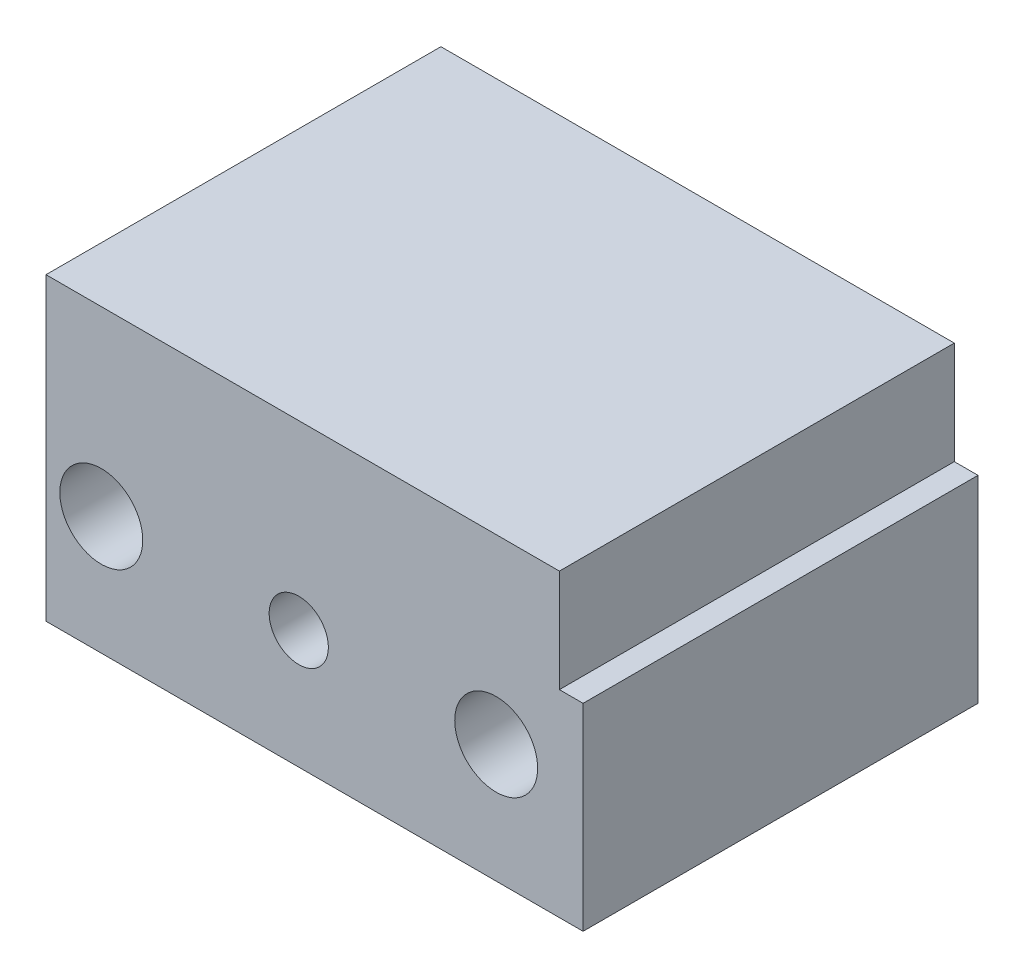
ISO-10303-21;
HEADER;
FILE_DESCRIPTION(('STEP AP214'),'2;1');
FILE_NAME('part.step','',(''),(''),'','','');
FILE_SCHEMA(('AUTOMOTIVE_DESIGN { 1 0 10303 214 1 1 1 1 }'));
ENDSEC;
DATA;
#1=APPLICATION_CONTEXT('core data for automotive mechanical design processes');
#2=APPLICATION_PROTOCOL_DEFINITION('international standard','automotive_design',2000,#1);
#3=PRODUCT_CONTEXT('',#1,'mechanical');
#4=PRODUCT('Part','Part','',(#3));
#5=PRODUCT_RELATED_PRODUCT_CATEGORY('part','',(#4));
#6=PRODUCT_DEFINITION_FORMATION('','',#4);
#7=PRODUCT_DEFINITION_CONTEXT('part definition',#1,'design');
#8=PRODUCT_DEFINITION('design','',#6,#7);
#9=PRODUCT_DEFINITION_SHAPE('','',#8);
#10=(LENGTH_UNIT() NAMED_UNIT(*) SI_UNIT(.MILLI.,.METRE.));
#11=(NAMED_UNIT(*) PLANE_ANGLE_UNIT() SI_UNIT($,.RADIAN.));
#12=(NAMED_UNIT(*) SI_UNIT($,.STERADIAN.) SOLID_ANGLE_UNIT());
#13=UNCERTAINTY_MEASURE_WITH_UNIT(LENGTH_MEASURE(1.E-05),#10,'distance_accuracy_value','');
#14=(GEOMETRIC_REPRESENTATION_CONTEXT(3) GLOBAL_UNCERTAINTY_ASSIGNED_CONTEXT((#13)) GLOBAL_UNIT_ASSIGNED_CONTEXT((#10,
#11,#12)) REPRESENTATION_CONTEXT('',''));
#15=CARTESIAN_POINT('',(0.,0.,0.));
#16=DIRECTION('',(0.,0.,1.));
#17=DIRECTION('',(1.,0.,0.));
#18=AXIS2_PLACEMENT_3D('',#15,#16,#17);
#19=CARTESIAN_POINT('',(0.,4.,0.));
#20=DIRECTION('',(0.,1.,0.));
#21=DIRECTION('',(0.,0.,1.));
#22=AXIS2_PLACEMENT_3D('',#19,#20,#21);
#23=PLANE('',#22);
#24=DIRECTION('',(1.,0.,0.));
#25=VECTOR('',#24,1.);
#26=CARTESIAN_POINT('',(0.,4.,5.));
#27=LINE('',#26,#25);
#28=CARTESIAN_POINT('',(0.,4.,5.));
#29=VERTEX_POINT('',#28);
#30=CARTESIAN_POINT('',(6.5,4.,5.));
#31=VERTEX_POINT('',#30);
#32=EDGE_CURVE('E148',#29,#31,#27,.T.);
#33=ORIENTED_EDGE('',*,*,#32,.T.);
#34=DIRECTION('',(0.,0.,1.));
#35=VECTOR('',#34,1.);
#36=CARTESIAN_POINT('',(6.5,4.,5.));
#37=LINE('',#36,#35);
#38=CARTESIAN_POINT('',(6.5,4.,0.));
#39=VERTEX_POINT('',#38);
#40=EDGE_CURVE('E106',#39,#31,#37,.T.);
#41=ORIENTED_EDGE('',*,*,#40,.F.);
#42=DIRECTION('',(-1.,0.,0.));
#43=VECTOR('',#42,1.);
#44=CARTESIAN_POINT('',(6.8,4.,0.));
#45=LINE('',#44,#43);
#46=CARTESIAN_POINT('',(0.,4.,0.));
#47=VERTEX_POINT('',#46);
#48=EDGE_CURVE('E144',#39,#47,#45,.T.);
#49=ORIENTED_EDGE('',*,*,#48,.T.);
#50=DIRECTION('',(0.,0.,1.));
#51=VECTOR('',#50,1.);
#52=CARTESIAN_POINT('',(0.,4.,0.));
#53=LINE('',#52,#51);
#54=EDGE_CURVE('E156',#47,#29,#53,.T.);
#55=ORIENTED_EDGE('',*,*,#54,.T.);
#56=EDGE_LOOP('',(#33,#41,#49,#55));
#57=FACE_BOUND('',#56,.T.);
#58=ADVANCED_FACE('F34',(#57),#23,.T.);
#59=CARTESIAN_POINT('',(6.8,0.2,0.));
#60=DIRECTION('',(0.,0.,-1.));
#61=DIRECTION('',(-1.,0.,0.));
#62=AXIS2_PLACEMENT_3D('',#59,#60,#61);
#63=PLANE('',#62);
#64=CARTESIAN_POINT('',(3.2,1.7,0.));
#65=DIRECTION('',(0.,0.,-1.));
#66=DIRECTION('',(-1.,0.,0.));
#67=AXIS2_PLACEMENT_3D('',#64,#65,#66);
#68=CIRCLE('',#67,0.374999999999999);
#69=CARTESIAN_POINT('',(2.825,1.7,0.));
#70=VERTEX_POINT('',#69);
#71=EDGE_CURVE('E172',#70,#70,#68,.T.);
#72=ORIENTED_EDGE('',*,*,#71,.F.);
#73=EDGE_LOOP('',(#72));
#74=FACE_BOUND('',#73,.T.);
#75=DIRECTION('',(1.,0.,0.));
#76=VECTOR('',#75,1.);
#77=CARTESIAN_POINT('',(6.5,2.7,0.));
#78=LINE('',#77,#76);
#79=CARTESIAN_POINT('',(6.5,2.7,0.));
#80=VERTEX_POINT('',#79);
#81=CARTESIAN_POINT('',(6.8,2.7,0.));
#82=VERTEX_POINT('',#81);
#83=EDGE_CURVE('E101',#80,#82,#78,.T.);
#84=ORIENTED_EDGE('',*,*,#83,.T.);
#85=DIRECTION('',(0.,1.,0.));
#86=VECTOR('',#85,1.);
#87=CARTESIAN_POINT('',(6.8,0.2,0.));
#88=LINE('',#87,#86);
#89=CARTESIAN_POINT('',(6.8,0.2,0.));
#90=VERTEX_POINT('',#89);
#91=EDGE_CURVE('E11',#90,#82,#88,.T.);
#92=ORIENTED_EDGE('',*,*,#91,.F.);
#93=DIRECTION('',(-1.,0.,0.));
#94=VECTOR('',#93,1.);
#95=CARTESIAN_POINT('',(6.8,0.2,0.));
#96=LINE('',#95,#94);
#97=CARTESIAN_POINT('',(0.,0.2,0.));
#98=VERTEX_POINT('',#97);
#99=EDGE_CURVE('E145',#90,#98,#96,.T.);
#100=ORIENTED_EDGE('',*,*,#99,.T.);
#101=DIRECTION('',(0.,1.,0.));
#102=VECTOR('',#101,1.);
#103=CARTESIAN_POINT('',(0.,0.2,0.));
#104=LINE('',#103,#102);
#105=EDGE_CURVE('E38',#98,#47,#104,.T.);
#106=ORIENTED_EDGE('',*,*,#105,.T.);
#107=ORIENTED_EDGE('',*,*,#48,.F.);
#108=DIRECTION('',(0.,1.,0.));
#109=VECTOR('',#108,1.);
#110=CARTESIAN_POINT('',(6.5,4.,0.));
#111=LINE('',#110,#109);
#112=EDGE_CURVE('E51',#80,#39,#111,.T.);
#113=ORIENTED_EDGE('',*,*,#112,.F.);
#114=EDGE_LOOP('',(#84,#92,#100,#106,#107,#113));
#115=FACE_BOUND('',#114,.T.);
#116=CARTESIAN_POINT('',(5.7,1.7,0.));
#117=DIRECTION('',(0.,0.,-1.));
#118=DIRECTION('',(-1.,0.,0.));
#119=AXIS2_PLACEMENT_3D('',#116,#117,#118);
#120=CIRCLE('',#119,0.650000000000015);
#121=CARTESIAN_POINT('',(5.04999999999998,1.7,0.));
#122=VERTEX_POINT('',#121);
#123=EDGE_CURVE('E116',#122,#122,#120,.T.);
#124=ORIENTED_EDGE('',*,*,#123,.F.);
#125=EDGE_LOOP('',(#124));
#126=FACE_BOUND('',#125,.T.);
#127=CARTESIAN_POINT('',(0.700000000000001,1.7,0.));
#128=DIRECTION('',(0.,0.,-1.));
#129=DIRECTION('',(-1.,0.,0.));
#130=AXIS2_PLACEMENT_3D('',#127,#128,#129);
#131=CIRCLE('',#130,0.650000000000015);
#132=CARTESIAN_POINT('',(0.0499999999999854,1.7,0.));
#133=VERTEX_POINT('',#132);
#134=EDGE_CURVE('E132',#133,#133,#131,.T.);
#135=ORIENTED_EDGE('',*,*,#134,.F.);
#136=EDGE_LOOP('',(#135));
#137=FACE_BOUND('',#136,.T.);
#138=ADVANCED_FACE('F36',(#74,#115,#126,#137),#63,.T.);
#139=CARTESIAN_POINT('',(6.8,0.2,5.));
#140=DIRECTION('',(1.,0.,0.));
#141=DIRECTION('',(0.,0.,-1.));
#142=AXIS2_PLACEMENT_3D('',#139,#140,#141);
#143=PLANE('',#142);
#144=DIRECTION('',(0.,0.,-1.));
#145=VECTOR('',#144,1.);
#146=CARTESIAN_POINT('',(6.8,2.7,5.));
#147=LINE('',#146,#145);
#148=CARTESIAN_POINT('',(6.8,2.7,5.));
#149=VERTEX_POINT('',#148);
#150=EDGE_CURVE('E109',#149,#82,#147,.T.);
#151=ORIENTED_EDGE('',*,*,#150,.F.);
#152=DIRECTION('',(0.,1.,0.));
#153=VECTOR('',#152,1.);
#154=CARTESIAN_POINT('',(6.8,0.2,5.));
#155=LINE('',#154,#153);
#156=CARTESIAN_POINT('',(6.8,0.2,5.));
#157=VERTEX_POINT('',#156);
#158=EDGE_CURVE('E43',#157,#149,#155,.T.);
#159=ORIENTED_EDGE('',*,*,#158,.F.);
#160=DIRECTION('',(0.,0.,-1.));
#161=VECTOR('',#160,1.);
#162=CARTESIAN_POINT('',(6.8,0.2,5.));
#163=LINE('',#162,#161);
#164=EDGE_CURVE('E152',#157,#90,#163,.T.);
#165=ORIENTED_EDGE('',*,*,#164,.T.);
#166=ORIENTED_EDGE('',*,*,#91,.T.);
#167=EDGE_LOOP('',(#151,#159,#165,#166));
#168=FACE_BOUND('',#167,.T.);
#169=ADVANCED_FACE('F169',(#168),#143,.T.);
#170=CARTESIAN_POINT('',(0.,0.2,5.));
#171=DIRECTION('',(0.,0.,1.));
#172=DIRECTION('',(1.,0.,0.));
#173=AXIS2_PLACEMENT_3D('',#170,#171,#172);
#174=PLANE('',#173);
#175=CARTESIAN_POINT('',(3.2,1.7,5.));
#176=DIRECTION('',(0.,0.,1.));
#177=DIRECTION('',(1.,0.,0.));
#178=AXIS2_PLACEMENT_3D('',#175,#176,#177);
#179=CIRCLE('',#178,0.374999999999999);
#180=CARTESIAN_POINT('',(3.575,1.7,5.));
#181=VERTEX_POINT('',#180);
#182=EDGE_CURVE('E170',#181,#181,#179,.T.);
#183=ORIENTED_EDGE('',*,*,#182,.F.);
#184=EDGE_LOOP('',(#183));
#185=FACE_BOUND('',#184,.T.);
#186=DIRECTION('',(1.,0.,0.));
#187=VECTOR('',#186,1.);
#188=CARTESIAN_POINT('',(6.5,2.7,5.));
#189=LINE('',#188,#187);
#190=CARTESIAN_POINT('',(6.5,2.7,5.));
#191=VERTEX_POINT('',#190);
#192=EDGE_CURVE('E99',#191,#149,#189,.T.);
#193=ORIENTED_EDGE('',*,*,#192,.F.);
#194=DIRECTION('',(0.,-1.,0.));
#195=VECTOR('',#194,1.);
#196=CARTESIAN_POINT('',(6.5,4.,5.));
#197=LINE('',#196,#195);
#198=EDGE_CURVE('E102',#31,#191,#197,.T.);
#199=ORIENTED_EDGE('',*,*,#198,.F.);
#200=ORIENTED_EDGE('',*,*,#32,.F.);
#201=DIRECTION('',(0.,1.,0.));
#202=VECTOR('',#201,1.);
#203=CARTESIAN_POINT('',(0.,0.2,5.));
#204=LINE('',#203,#202);
#205=CARTESIAN_POINT('',(0.,0.2,5.));
#206=VERTEX_POINT('',#205);
#207=EDGE_CURVE('E75',#206,#29,#204,.T.);
#208=ORIENTED_EDGE('',*,*,#207,.F.);
#209=DIRECTION('',(1.,0.,0.));
#210=VECTOR('',#209,1.);
#211=CARTESIAN_POINT('',(0.,0.2,5.));
#212=LINE('',#211,#210);
#213=EDGE_CURVE('E150',#206,#157,#212,.T.);
#214=ORIENTED_EDGE('',*,*,#213,.T.);
#215=ORIENTED_EDGE('',*,*,#158,.T.);
#216=EDGE_LOOP('',(#193,#199,#200,#208,#214,#215));
#217=FACE_BOUND('',#216,.T.);
#218=CARTESIAN_POINT('',(5.7,1.7,5.));
#219=DIRECTION('',(0.,0.,-1.));
#220=DIRECTION('',(-1.,0.,0.));
#221=AXIS2_PLACEMENT_3D('',#218,#219,#220);
#222=CIRCLE('',#221,0.525000000000013);
#223=CARTESIAN_POINT('',(5.17499999999999,1.7,5.));
#224=VERTEX_POINT('',#223);
#225=EDGE_CURVE('E129',#224,#224,#222,.T.);
#226=ORIENTED_EDGE('',*,*,#225,.T.);
#227=EDGE_LOOP('',(#226));
#228=FACE_BOUND('',#227,.T.);
#229=CARTESIAN_POINT('',(0.700000000000001,1.7,5.));
#230=DIRECTION('',(0.,0.,-1.));
#231=DIRECTION('',(-1.,0.,0.));
#232=AXIS2_PLACEMENT_3D('',#229,#230,#231);
#233=CIRCLE('',#232,0.525000000000013);
#234=CARTESIAN_POINT('',(0.174999999999988,1.7,5.));
#235=VERTEX_POINT('',#234);
#236=EDGE_CURVE('E141',#235,#235,#233,.T.);
#237=ORIENTED_EDGE('',*,*,#236,.T.);
#238=EDGE_LOOP('',(#237));
#239=FACE_BOUND('',#238,.T.);
#240=ADVANCED_FACE('F112',(#185,#217,#228,#239),#174,.T.);
#241=CARTESIAN_POINT('',(0.,0.2,0.));
#242=DIRECTION('',(-1.,0.,0.));
#243=DIRECTION('',(0.,0.,1.));
#244=AXIS2_PLACEMENT_3D('',#241,#242,#243);
#245=PLANE('',#244);
#246=ORIENTED_EDGE('',*,*,#54,.F.);
#247=ORIENTED_EDGE('',*,*,#105,.F.);
#248=DIRECTION('',(0.,0.,1.));
#249=VECTOR('',#248,1.);
#250=CARTESIAN_POINT('',(0.,0.2,0.));
#251=LINE('',#250,#249);
#252=EDGE_CURVE('E147',#98,#206,#251,.T.);
#253=ORIENTED_EDGE('',*,*,#252,.T.);
#254=ORIENTED_EDGE('',*,*,#207,.T.);
#255=EDGE_LOOP('',(#246,#247,#253,#254));
#256=FACE_BOUND('',#255,.T.);
#257=ADVANCED_FACE('F162',(#256),#245,.T.);
#258=CARTESIAN_POINT('',(0.,0.2,0.));
#259=DIRECTION('',(0.,1.,0.));
#260=DIRECTION('',(0.,0.,1.));
#261=AXIS2_PLACEMENT_3D('',#258,#259,#260);
#262=PLANE('',#261);
#263=ORIENTED_EDGE('',*,*,#99,.F.);
#264=ORIENTED_EDGE('',*,*,#164,.F.);
#265=ORIENTED_EDGE('',*,*,#213,.F.);
#266=ORIENTED_EDGE('',*,*,#252,.F.);
#267=EDGE_LOOP('',(#263,#264,#265,#266));
#268=FACE_BOUND('',#267,.T.);
#269=ADVANCED_FACE('F167',(#268),#262,.F.);
#270=CARTESIAN_POINT('',(0.700000000000001,1.7,0.));
#271=DIRECTION('',(0.,0.,-1.));
#272=DIRECTION('',(-1.,0.,0.));
#273=AXIS2_PLACEMENT_3D('',#270,#271,#272);
#274=CYLINDRICAL_SURFACE('',#273,0.525000000000013);
#275=ORIENTED_EDGE('',*,*,#236,.F.);
#276=EDGE_LOOP('',(#275));
#277=FACE_BOUND('',#276,.T.);
#278=CARTESIAN_POINT('',(0.700000000000001,1.7,1.2));
#279=DIRECTION('',(0.,0.,-1.));
#280=DIRECTION('',(-1.,0.,0.));
#281=AXIS2_PLACEMENT_3D('',#278,#279,#280);
#282=CIRCLE('',#281,0.525000000000013);
#283=CARTESIAN_POINT('',(0.174999999999987,1.7,1.2));
#284=VERTEX_POINT('',#283);
#285=EDGE_CURVE('E138',#284,#284,#282,.T.);
#286=ORIENTED_EDGE('',*,*,#285,.T.);
#287=EDGE_LOOP('',(#286));
#288=FACE_BOUND('',#287,.T.);
#289=ADVANCED_FACE('F200',(#277,#288),#274,.F.);
#290=CARTESIAN_POINT('',(1.22500000000001,1.7,1.2));
#291=DIRECTION('',(0.,0.,1.));
#292=DIRECTION('',(1.,0.,0.));
#293=AXIS2_PLACEMENT_3D('',#290,#291,#292);
#294=PLANE('',#293);
#295=ORIENTED_EDGE('',*,*,#285,.F.);
#296=EDGE_LOOP('',(#295));
#297=FACE_BOUND('',#296,.T.);
#298=CARTESIAN_POINT('',(0.700000000000001,1.7,1.2));
#299=DIRECTION('',(0.,0.,-1.));
#300=DIRECTION('',(-1.,0.,0.));
#301=AXIS2_PLACEMENT_3D('',#298,#299,#300);
#302=CIRCLE('',#301,0.650000000000015);
#303=CARTESIAN_POINT('',(0.0499999999999854,1.7,1.2));
#304=VERTEX_POINT('',#303);
#305=EDGE_CURVE('E135',#304,#304,#302,.T.);
#306=ORIENTED_EDGE('',*,*,#305,.T.);
#307=EDGE_LOOP('',(#306));
#308=FACE_BOUND('',#307,.T.);
#309=ADVANCED_FACE('F204',(#297,#308),#294,.F.);
#310=CARTESIAN_POINT('',(0.700000000000001,1.7,0.));
#311=DIRECTION('',(0.,0.,-1.));
#312=DIRECTION('',(-1.,0.,0.));
#313=AXIS2_PLACEMENT_3D('',#310,#311,#312);
#314=CYLINDRICAL_SURFACE('',#313,0.650000000000015);
#315=ORIENTED_EDGE('',*,*,#305,.F.);
#316=EDGE_LOOP('',(#315));
#317=FACE_BOUND('',#316,.T.);
#318=ORIENTED_EDGE('',*,*,#134,.T.);
#319=EDGE_LOOP('',(#318));
#320=FACE_BOUND('',#319,.T.);
#321=ADVANCED_FACE('F209',(#317,#320),#314,.F.);
#322=CARTESIAN_POINT('',(5.7,1.7,0.));
#323=DIRECTION('',(0.,0.,-1.));
#324=DIRECTION('',(-1.,0.,0.));
#325=AXIS2_PLACEMENT_3D('',#322,#323,#324);
#326=CYLINDRICAL_SURFACE('',#325,0.525000000000013);
#327=ORIENTED_EDGE('',*,*,#225,.F.);
#328=EDGE_LOOP('',(#327));
#329=FACE_BOUND('',#328,.T.);
#330=CARTESIAN_POINT('',(5.7,1.7,1.2));
#331=DIRECTION('',(0.,0.,-1.));
#332=DIRECTION('',(-1.,0.,0.));
#333=AXIS2_PLACEMENT_3D('',#330,#331,#332);
#334=CIRCLE('',#333,0.525000000000013);
#335=CARTESIAN_POINT('',(5.17499999999999,1.7,1.2));
#336=VERTEX_POINT('',#335);
#337=EDGE_CURVE('E126',#336,#336,#334,.T.);
#338=ORIENTED_EDGE('',*,*,#337,.T.);
#339=EDGE_LOOP('',(#338));
#340=FACE_BOUND('',#339,.T.);
#341=ADVANCED_FACE('F217',(#329,#340),#326,.F.);
#342=CARTESIAN_POINT('',(6.22500000000001,1.7,1.2));
#343=DIRECTION('',(0.,0.,1.));
#344=DIRECTION('',(1.,0.,0.));
#345=AXIS2_PLACEMENT_3D('',#342,#343,#344);
#346=PLANE('',#345);
#347=ORIENTED_EDGE('',*,*,#337,.F.);
#348=EDGE_LOOP('',(#347));
#349=FACE_BOUND('',#348,.T.);
#350=CARTESIAN_POINT('',(5.7,1.7,1.2));
#351=DIRECTION('',(0.,0.,-1.));
#352=DIRECTION('',(-1.,0.,0.));
#353=AXIS2_PLACEMENT_3D('',#350,#351,#352);
#354=CIRCLE('',#353,0.650000000000015);
#355=CARTESIAN_POINT('',(5.04999999999998,1.7,1.2));
#356=VERTEX_POINT('',#355);
#357=EDGE_CURVE('E123',#356,#356,#354,.T.);
#358=ORIENTED_EDGE('',*,*,#357,.T.);
#359=EDGE_LOOP('',(#358));
#360=FACE_BOUND('',#359,.T.);
#361=ADVANCED_FACE('F221',(#349,#360),#346,.F.);
#362=CARTESIAN_POINT('',(5.7,1.7,0.));
#363=DIRECTION('',(0.,0.,-1.));
#364=DIRECTION('',(-1.,0.,0.));
#365=AXIS2_PLACEMENT_3D('',#362,#363,#364);
#366=CYLINDRICAL_SURFACE('',#365,0.650000000000015);
#367=ORIENTED_EDGE('',*,*,#357,.F.);
#368=EDGE_LOOP('',(#367));
#369=FACE_BOUND('',#368,.T.);
#370=ORIENTED_EDGE('',*,*,#123,.T.);
#371=EDGE_LOOP('',(#370));
#372=FACE_BOUND('',#371,.T.);
#373=ADVANCED_FACE('F225',(#369,#372),#366,.F.);
#374=CARTESIAN_POINT('',(6.5,2.7,5.));
#375=DIRECTION('',(0.,-1.,0.));
#376=DIRECTION('',(0.,0.,-1.));
#377=AXIS2_PLACEMENT_3D('',#374,#375,#376);
#378=PLANE('',#377);
#379=ORIENTED_EDGE('',*,*,#150,.T.);
#380=ORIENTED_EDGE('',*,*,#83,.F.);
#381=DIRECTION('',(0.,0.,-1.));
#382=VECTOR('',#381,1.);
#383=CARTESIAN_POINT('',(6.5,2.7,5.));
#384=LINE('',#383,#382);
#385=EDGE_CURVE('E95',#191,#80,#384,.T.);
#386=ORIENTED_EDGE('',*,*,#385,.F.);
#387=ORIENTED_EDGE('',*,*,#192,.T.);
#388=EDGE_LOOP('',(#379,#380,#386,#387));
#389=FACE_BOUND('',#388,.T.);
#390=ADVANCED_FACE('F97',(#389),#378,.F.);
#391=CARTESIAN_POINT('',(6.5,0.,0.));
#392=DIRECTION('',(1.,0.,0.));
#393=DIRECTION('',(0.,0.,-1.));
#394=AXIS2_PLACEMENT_3D('',#391,#392,#393);
#395=PLANE('',#394);
#396=ORIENTED_EDGE('',*,*,#198,.T.);
#397=ORIENTED_EDGE('',*,*,#385,.T.);
#398=ORIENTED_EDGE('',*,*,#112,.T.);
#399=ORIENTED_EDGE('',*,*,#40,.T.);
#400=EDGE_LOOP('',(#396,#397,#398,#399));
#401=FACE_BOUND('',#400,.T.);
#402=ADVANCED_FACE('F105',(#401),#395,.T.);
#403=CARTESIAN_POINT('',(3.2,1.7,0.));
#404=DIRECTION('',(0.,0.,-1.));
#405=DIRECTION('',(-1.,0.,0.));
#406=AXIS2_PLACEMENT_3D('',#403,#404,#405);
#407=CYLINDRICAL_SURFACE('',#406,0.374999999999999);
#408=ORIENTED_EDGE('',*,*,#71,.T.);
#409=EDGE_LOOP('',(#408));
#410=FACE_BOUND('',#409,.T.);
#411=ORIENTED_EDGE('',*,*,#182,.T.);
#412=EDGE_LOOP('',(#411));
#413=FACE_BOUND('',#412,.T.);
#414=ADVANCED_FACE('F179',(#410,#413),#407,.F.);
#415=CLOSED_SHELL('',(#58,#138,#169,#240,#257,#269,#289,#309,#321,#341,#361,#373,#390,#402,#414));
#416=MANIFOLD_SOLID_BREP('B2',#415);
#417=ADVANCED_BREP_SHAPE_REPRESENTATION('',(#18,#416),#14);
#418=SHAPE_DEFINITION_REPRESENTATION(#9,#417);
ENDSEC;
END-ISO-10303-21;
